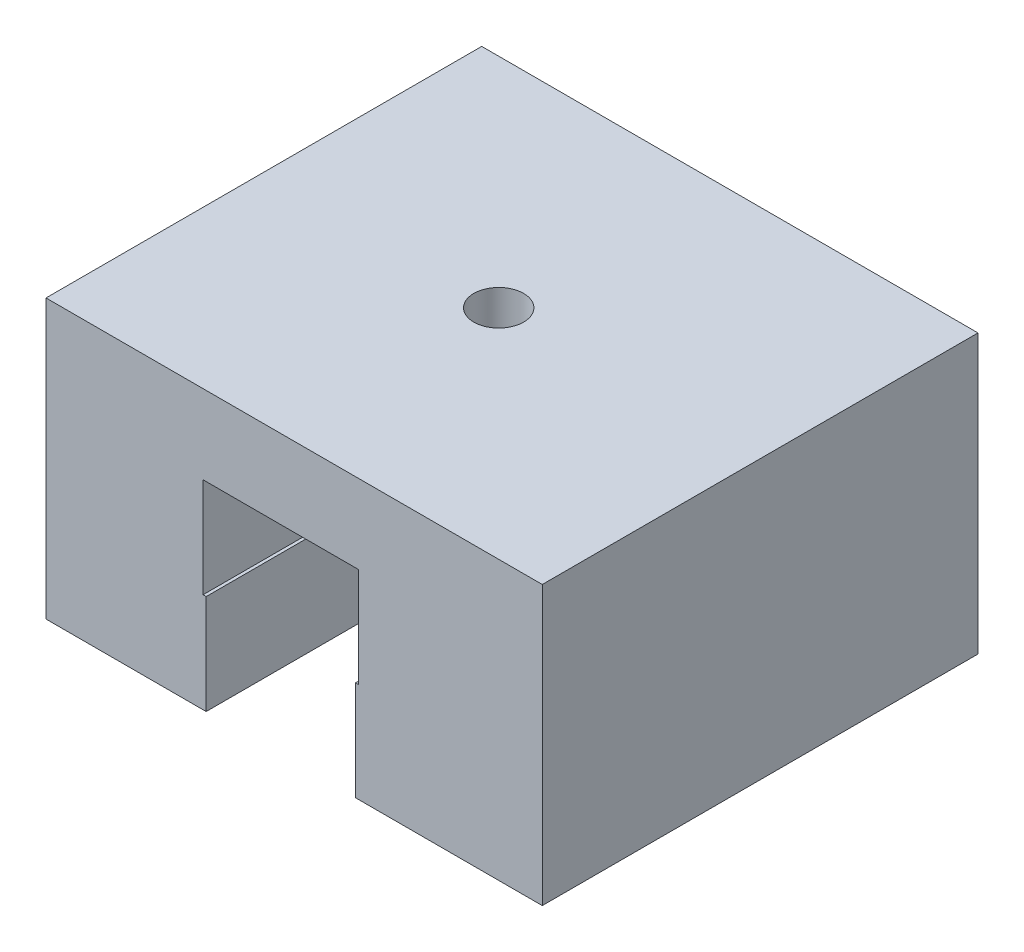
ISO-10303-21;
HEADER;
FILE_DESCRIPTION(('STEP AP214'),'2;1');
FILE_NAME('part.step','',(''),(''),'','','');
FILE_SCHEMA(('AUTOMOTIVE_DESIGN { 1 0 10303 214 1 1 1 1 }'));
ENDSEC;
DATA;
#1=APPLICATION_CONTEXT('core data for automotive mechanical design processes');
#2=APPLICATION_PROTOCOL_DEFINITION('international standard','automotive_design',2000,#1);
#3=PRODUCT_CONTEXT('',#1,'mechanical');
#4=PRODUCT('Part','Part','',(#3));
#5=PRODUCT_RELATED_PRODUCT_CATEGORY('part','',(#4));
#6=PRODUCT_DEFINITION_FORMATION('','',#4);
#7=PRODUCT_DEFINITION_CONTEXT('part definition',#1,'design');
#8=PRODUCT_DEFINITION('design','',#6,#7);
#9=PRODUCT_DEFINITION_SHAPE('','',#8);
#10=(LENGTH_UNIT() NAMED_UNIT(*) SI_UNIT(.MILLI.,.METRE.));
#11=(NAMED_UNIT(*) PLANE_ANGLE_UNIT() SI_UNIT($,.RADIAN.));
#12=(NAMED_UNIT(*) SI_UNIT($,.STERADIAN.) SOLID_ANGLE_UNIT());
#13=UNCERTAINTY_MEASURE_WITH_UNIT(LENGTH_MEASURE(1.E-05),#10,'distance_accuracy_value','');
#14=(GEOMETRIC_REPRESENTATION_CONTEXT(3) GLOBAL_UNCERTAINTY_ASSIGNED_CONTEXT((#13)) GLOBAL_UNIT_ASSIGNED_CONTEXT((#10,
#11,#12)) REPRESENTATION_CONTEXT('',''));
#15=CARTESIAN_POINT('',(0.,0.,0.));
#16=DIRECTION('',(0.,0.,1.));
#17=DIRECTION('',(1.,0.,0.));
#18=AXIS2_PLACEMENT_3D('',#15,#16,#17);
#19=CARTESIAN_POINT('',(-200.,30.,17.4999999999999));
#20=DIRECTION('',(0.,0.,-1.));
#21=DIRECTION('',(-1.,0.,0.));
#22=AXIS2_PLACEMENT_3D('',#19,#20,#21);
#23=PLANE('',#22);
#24=DIRECTION('',(0.,-1.,0.));
#25=VECTOR('',#24,1.);
#26=CARTESIAN_POINT('',(-39.8657799997887,0.,17.5));
#27=LINE('',#26,#25);
#28=CARTESIAN_POINT('',(-39.8657799997887,22.3404540291583,17.5));
#29=VERTEX_POINT('',#28);
#30=CARTESIAN_POINT('',(-39.8657799997887,0.,17.5));
#31=VERTEX_POINT('',#30);
#32=EDGE_CURVE('E130',#29,#31,#27,.T.);
#33=ORIENTED_EDGE('',*,*,#32,.T.);
#34=DIRECTION('',(1.,0.,0.));
#35=VECTOR('',#34,1.);
#36=CARTESIAN_POINT('',(-200.,0.,17.4999999999999));
#37=LINE('',#36,#35);
#38=CARTESIAN_POINT('',(-27.,0.,17.5));
#39=VERTEX_POINT('',#38);
#40=EDGE_CURVE('E222',#31,#39,#37,.T.);
#41=ORIENTED_EDGE('',*,*,#40,.T.);
#42=DIRECTION('',(0.,-1.,0.));
#43=VECTOR('',#42,1.);
#44=CARTESIAN_POINT('',(-27.,8.,17.5));
#45=LINE('',#44,#43);
#46=CARTESIAN_POINT('',(-27.,8.,17.5));
#47=VERTEX_POINT('',#46);
#48=EDGE_CURVE('E167',#47,#39,#45,.T.);
#49=ORIENTED_EDGE('',*,*,#48,.F.);
#50=DIRECTION('',(1.,0.,0.));
#51=VECTOR('',#50,1.);
#52=CARTESIAN_POINT('',(-27.25,8.,17.5));
#53=LINE('',#52,#51);
#54=CARTESIAN_POINT('',(-27.25,8.,17.5));
#55=VERTEX_POINT('',#54);
#56=EDGE_CURVE('E164',#55,#47,#53,.T.);
#57=ORIENTED_EDGE('',*,*,#56,.F.);
#58=DIRECTION('',(0.,-1.,0.));
#59=VECTOR('',#58,1.);
#60=CARTESIAN_POINT('',(-27.25,8.,17.5));
#61=LINE('',#60,#59);
#62=CARTESIAN_POINT('',(-27.25,16.,17.5));
#63=VERTEX_POINT('',#62);
#64=EDGE_CURVE('E161',#63,#55,#61,.T.);
#65=ORIENTED_EDGE('',*,*,#64,.F.);
#66=DIRECTION('',(-1.,0.,0.));
#67=VECTOR('',#66,1.);
#68=CARTESIAN_POINT('',(-21.,16.,17.5));
#69=LINE('',#68,#67);
#70=CARTESIAN_POINT('',(-14.75,16.,17.5));
#71=VERTEX_POINT('',#70);
#72=EDGE_CURVE('E157',#71,#63,#69,.T.);
#73=ORIENTED_EDGE('',*,*,#72,.F.);
#74=DIRECTION('',(0.,1.,0.));
#75=VECTOR('',#74,1.);
#76=CARTESIAN_POINT('',(-14.75,8.,17.5));
#77=LINE('',#76,#75);
#78=CARTESIAN_POINT('',(-14.75,8.,17.5));
#79=VERTEX_POINT('',#78);
#80=EDGE_CURVE('E176',#79,#71,#77,.T.);
#81=ORIENTED_EDGE('',*,*,#80,.F.);
#82=DIRECTION('',(1.,0.,0.));
#83=VECTOR('',#82,1.);
#84=CARTESIAN_POINT('',(-15.,8.,17.5));
#85=LINE('',#84,#83);
#86=CARTESIAN_POINT('',(-15.,8.,17.5));
#87=VERTEX_POINT('',#86);
#88=EDGE_CURVE('E173',#87,#79,#85,.T.);
#89=ORIENTED_EDGE('',*,*,#88,.F.);
#90=DIRECTION('',(0.,1.,0.));
#91=VECTOR('',#90,1.);
#92=CARTESIAN_POINT('',(-15.,0.,17.5));
#93=LINE('',#92,#91);
#94=CARTESIAN_POINT('',(-15.,0.,17.5));
#95=VERTEX_POINT('',#94);
#96=EDGE_CURVE('E170',#95,#87,#93,.T.);
#97=ORIENTED_EDGE('',*,*,#96,.F.);
#98=CARTESIAN_POINT('',(0.,0.,17.5));
#99=VERTEX_POINT('',#98);
#100=EDGE_CURVE('E221',#95,#99,#37,.T.);
#101=ORIENTED_EDGE('',*,*,#100,.T.);
#102=DIRECTION('',(0.,-1.,0.));
#103=VECTOR('',#102,1.);
#104=CARTESIAN_POINT('',(0.,30.,17.5));
#105=LINE('',#104,#103);
#106=CARTESIAN_POINT('',(0.,22.3404540291583,17.5));
#107=VERTEX_POINT('',#106);
#108=EDGE_CURVE('E225',#107,#99,#105,.T.);
#109=ORIENTED_EDGE('',*,*,#108,.F.);
#110=DIRECTION('',(1.,0.,0.));
#111=VECTOR('',#110,1.);
#112=CARTESIAN_POINT('',(0.,22.3404540291583,17.5));
#113=LINE('',#112,#111);
#114=EDGE_CURVE('E146',#29,#107,#113,.T.);
#115=ORIENTED_EDGE('',*,*,#114,.F.);
#116=EDGE_LOOP('',(#33,#41,#49,#57,#65,#73,#81,#89,#97,#101,#109,#115));
#117=FACE_BOUND('',#116,.T.);
#118=ADVANCED_FACE('F33',(#117),#23,.F.);
#119=CARTESIAN_POINT('',(-200.,30.,-17.5));
#120=DIRECTION('',(0.,0.,-1.));
#121=DIRECTION('',(-1.,0.,0.));
#122=AXIS2_PLACEMENT_3D('',#119,#120,#121);
#123=PLANE('',#122);
#124=DIRECTION('',(1.,0.,0.));
#125=VECTOR('',#124,1.);
#126=CARTESIAN_POINT('',(-200.,0.,-17.5));
#127=LINE('',#126,#125);
#128=CARTESIAN_POINT('',(-39.8657799997887,0.,-17.5));
#129=VERTEX_POINT('',#128);
#130=CARTESIAN_POINT('',(0.,0.,-17.5));
#131=VERTEX_POINT('',#130);
#132=EDGE_CURVE('E145',#129,#131,#127,.T.);
#133=ORIENTED_EDGE('',*,*,#132,.F.);
#134=DIRECTION('',(0.,-1.,0.));
#135=VECTOR('',#134,1.);
#136=CARTESIAN_POINT('',(-39.8657799997887,0.,-17.5));
#137=LINE('',#136,#135);
#138=CARTESIAN_POINT('',(-39.8657799997887,22.3404540291583,-17.5));
#139=VERTEX_POINT('',#138);
#140=EDGE_CURVE('E48',#139,#129,#137,.T.);
#141=ORIENTED_EDGE('',*,*,#140,.F.);
#142=DIRECTION('',(1.,0.,0.));
#143=VECTOR('',#142,1.);
#144=CARTESIAN_POINT('',(0.,22.3404540291583,-17.5));
#145=LINE('',#144,#143);
#146=CARTESIAN_POINT('',(0.,22.3404540291583,-17.5));
#147=VERTEX_POINT('',#146);
#148=EDGE_CURVE('E134',#139,#147,#145,.T.);
#149=ORIENTED_EDGE('',*,*,#148,.T.);
#150=DIRECTION('',(0.,-1.,0.));
#151=VECTOR('',#150,1.);
#152=CARTESIAN_POINT('',(0.,30.,-17.5));
#153=LINE('',#152,#151);
#154=EDGE_CURVE('E224',#147,#131,#153,.T.);
#155=ORIENTED_EDGE('',*,*,#154,.T.);
#156=EDGE_LOOP('',(#133,#141,#149,#155));
#157=FACE_BOUND('',#156,.T.);
#158=ADVANCED_FACE('F35',(#157),#123,.T.);
#159=CARTESIAN_POINT('',(0.,0.,0.));
#160=DIRECTION('',(0.,-1.,0.));
#161=DIRECTION('',(0.,0.,-1.));
#162=AXIS2_PLACEMENT_3D('',#159,#160,#161);
#163=PLANE('',#162);
#164=ORIENTED_EDGE('',*,*,#40,.F.);
#165=DIRECTION('',(0.,0.,-1.));
#166=VECTOR('',#165,1.);
#167=CARTESIAN_POINT('',(-39.8657799997887,0.,0.));
#168=LINE('',#167,#166);
#169=EDGE_CURVE('E11',#31,#129,#168,.T.);
#170=ORIENTED_EDGE('',*,*,#169,.T.);
#171=ORIENTED_EDGE('',*,*,#132,.T.);
#172=DIRECTION('',(0.,0.,-1.));
#173=VECTOR('',#172,1.);
#174=CARTESIAN_POINT('',(0.,0.,17.5));
#175=LINE('',#174,#173);
#176=EDGE_CURVE('E218',#99,#131,#175,.T.);
#177=ORIENTED_EDGE('',*,*,#176,.F.);
#178=ORIENTED_EDGE('',*,*,#100,.F.);
#179=DIRECTION('',(0.,0.,1.));
#180=VECTOR('',#179,1.);
#181=CARTESIAN_POINT('',(-15.,0.,0.));
#182=LINE('',#181,#180);
#183=CARTESIAN_POINT('',(-15.,0.,0.));
#184=VERTEX_POINT('',#183);
#185=EDGE_CURVE('E183',#184,#95,#182,.T.);
#186=ORIENTED_EDGE('',*,*,#185,.F.);
#187=CARTESIAN_POINT('',(-21.,0.,0.));
#188=DIRECTION('',(0.,-1.,0.));
#189=DIRECTION('',(0.,0.,-1.));
#190=AXIS2_PLACEMENT_3D('',#187,#188,#189);
#191=CIRCLE('',#190,6.);
#192=CARTESIAN_POINT('',(-27.,0.,0.));
#193=VERTEX_POINT('',#192);
#194=EDGE_CURVE('E214',#193,#184,#191,.T.);
#195=ORIENTED_EDGE('',*,*,#194,.F.);
#196=DIRECTION('',(0.,0.,1.));
#197=VECTOR('',#196,1.);
#198=CARTESIAN_POINT('',(-27.,0.,0.));
#199=LINE('',#198,#197);
#200=EDGE_CURVE('E185',#193,#39,#199,.T.);
#201=ORIENTED_EDGE('',*,*,#200,.T.);
#202=EDGE_LOOP('',(#164,#170,#171,#177,#178,#186,#195,#201));
#203=FACE_BOUND('',#202,.T.);
#204=ADVANCED_FACE('F253',(#203),#163,.T.);
#205=CARTESIAN_POINT('',(-21.,30.,0.));
#206=DIRECTION('',(0.,-1.,0.));
#207=DIRECTION('',(0.,0.,-1.));
#208=AXIS2_PLACEMENT_3D('',#205,#206,#207);
#209=CYLINDRICAL_SURFACE('',#208,6.);
#210=DIRECTION('',(0.,-1.,0.));
#211=VECTOR('',#210,1.);
#212=CARTESIAN_POINT('',(-27.,8.,0.));
#213=LINE('',#212,#211);
#214=CARTESIAN_POINT('',(-27.,8.,0.));
#215=VERTEX_POINT('',#214);
#216=EDGE_CURVE('E153',#215,#193,#213,.T.);
#217=ORIENTED_EDGE('',*,*,#216,.T.);
#218=ORIENTED_EDGE('',*,*,#194,.T.);
#219=DIRECTION('',(0.,1.,0.));
#220=VECTOR('',#219,1.);
#221=CARTESIAN_POINT('',(-15.,0.,0.));
#222=LINE('',#221,#220);
#223=CARTESIAN_POINT('',(-15.,8.,0.));
#224=VERTEX_POINT('',#223);
#225=EDGE_CURVE('E156',#184,#224,#222,.T.);
#226=ORIENTED_EDGE('',*,*,#225,.T.);
#227=CARTESIAN_POINT('',(-21.,8.,0.));
#228=DIRECTION('',(0.,1.,0.));
#229=DIRECTION('',(0.,0.,1.));
#230=AXIS2_PLACEMENT_3D('',#227,#228,#229);
#231=CIRCLE('',#230,6.);
#232=EDGE_CURVE('E208',#215,#224,#231,.F.);
#233=ORIENTED_EDGE('',*,*,#232,.F.);
#234=EDGE_LOOP('',(#217,#218,#226,#233));
#235=FACE_BOUND('',#234,.T.);
#236=ADVANCED_FACE('F259',(#235),#209,.F.);
#237=CARTESIAN_POINT('',(0.,30.,17.5));
#238=DIRECTION('',(-1.,0.,0.));
#239=DIRECTION('',(0.,0.,1.));
#240=AXIS2_PLACEMENT_3D('',#237,#238,#239);
#241=PLANE('',#240);
#242=ORIENTED_EDGE('',*,*,#154,.F.);
#243=DIRECTION('',(0.,0.,1.));
#244=VECTOR('',#243,1.);
#245=CARTESIAN_POINT('',(0.,22.3404540291583,17.5));
#246=LINE('',#245,#244);
#247=EDGE_CURVE('E139',#147,#107,#246,.T.);
#248=ORIENTED_EDGE('',*,*,#247,.T.);
#249=ORIENTED_EDGE('',*,*,#108,.T.);
#250=ORIENTED_EDGE('',*,*,#176,.T.);
#251=EDGE_LOOP('',(#242,#248,#249,#250));
#252=FACE_BOUND('',#251,.T.);
#253=ADVANCED_FACE('F256',(#252),#241,.F.);
#254=CARTESIAN_POINT('',(0.,8.,0.));
#255=DIRECTION('',(0.,1.,0.));
#256=DIRECTION('',(0.,0.,1.));
#257=AXIS2_PLACEMENT_3D('',#254,#255,#256);
#258=PLANE('',#257);
#259=DIRECTION('',(0.,0.,1.));
#260=VECTOR('',#259,1.);
#261=CARTESIAN_POINT('',(-15.,8.,0.));
#262=LINE('',#261,#260);
#263=EDGE_CURVE('E181',#224,#87,#262,.T.);
#264=ORIENTED_EDGE('',*,*,#263,.T.);
#265=ORIENTED_EDGE('',*,*,#88,.T.);
#266=DIRECTION('',(0.,0.,-1.));
#267=VECTOR('',#266,1.);
#268=CARTESIAN_POINT('',(-14.75,8.,3.60843918243516));
#269=LINE('',#268,#267);
#270=CARTESIAN_POINT('',(-14.75,8.,-3.60843918243516));
#271=VERTEX_POINT('',#270);
#272=EDGE_CURVE('E194',#79,#271,#269,.T.);
#273=ORIENTED_EDGE('',*,*,#272,.T.);
#274=DIRECTION('',(-0.866025403784439,0.,-0.5));
#275=VECTOR('',#274,1.);
#276=CARTESIAN_POINT('',(-14.75,8.,-3.60843918243516));
#277=LINE('',#276,#275);
#278=CARTESIAN_POINT('',(-21.,8.,-7.21687836487032));
#279=VERTEX_POINT('',#278);
#280=EDGE_CURVE('E196',#271,#279,#277,.T.);
#281=ORIENTED_EDGE('',*,*,#280,.T.);
#282=DIRECTION('',(-0.866025403784439,0.,0.5));
#283=VECTOR('',#282,1.);
#284=CARTESIAN_POINT('',(-21.,8.,-7.21687836487032));
#285=LINE('',#284,#283);
#286=CARTESIAN_POINT('',(-27.25,8.,-3.60843918243516));
#287=VERTEX_POINT('',#286);
#288=EDGE_CURVE('E199',#279,#287,#285,.T.);
#289=ORIENTED_EDGE('',*,*,#288,.T.);
#290=DIRECTION('',(0.,0.,1.));
#291=VECTOR('',#290,1.);
#292=CARTESIAN_POINT('',(-27.25,8.,-3.60843918243516));
#293=LINE('',#292,#291);
#294=EDGE_CURVE('E202',#287,#55,#293,.T.);
#295=ORIENTED_EDGE('',*,*,#294,.T.);
#296=ORIENTED_EDGE('',*,*,#56,.T.);
#297=DIRECTION('',(0.,0.,1.));
#298=VECTOR('',#297,1.);
#299=CARTESIAN_POINT('',(-27.,8.,0.));
#300=LINE('',#299,#298);
#301=EDGE_CURVE('E160',#215,#47,#300,.T.);
#302=ORIENTED_EDGE('',*,*,#301,.F.);
#303=ORIENTED_EDGE('',*,*,#232,.T.);
#304=EDGE_LOOP('',(#264,#265,#273,#281,#289,#295,#296,#302,#303));
#305=FACE_BOUND('',#304,.T.);
#306=ADVANCED_FACE('F258',(#305),#258,.T.);
#307=CARTESIAN_POINT('',(-14.75,8.,3.60843918243516));
#308=DIRECTION('',(1.,0.,0.));
#309=DIRECTION('',(0.,0.,-1.));
#310=AXIS2_PLACEMENT_3D('',#307,#308,#309);
#311=PLANE('',#310);
#312=DIRECTION('',(0.,0.,-1.));
#313=VECTOR('',#312,1.);
#314=CARTESIAN_POINT('',(-14.75,16.,3.60843918243516));
#315=LINE('',#314,#313);
#316=CARTESIAN_POINT('',(-14.75,16.,-3.60843918243516));
#317=VERTEX_POINT('',#316);
#318=EDGE_CURVE('E192',#71,#317,#315,.T.);
#319=ORIENTED_EDGE('',*,*,#318,.T.);
#320=DIRECTION('',(0.,1.,0.));
#321=VECTOR('',#320,1.);
#322=CARTESIAN_POINT('',(-14.75,8.,-3.60843918243516));
#323=LINE('',#322,#321);
#324=EDGE_CURVE('E204',#271,#317,#323,.T.);
#325=ORIENTED_EDGE('',*,*,#324,.F.);
#326=ORIENTED_EDGE('',*,*,#272,.F.);
#327=ORIENTED_EDGE('',*,*,#80,.T.);
#328=EDGE_LOOP('',(#319,#325,#326,#327));
#329=FACE_BOUND('',#328,.T.);
#330=ADVANCED_FACE('F265',(#329),#311,.F.);
#331=CARTESIAN_POINT('',(-27.25,8.,-3.60843918243516));
#332=DIRECTION('',(-1.,0.,0.));
#333=DIRECTION('',(0.,0.,1.));
#334=AXIS2_PLACEMENT_3D('',#331,#332,#333);
#335=PLANE('',#334);
#336=ORIENTED_EDGE('',*,*,#64,.T.);
#337=ORIENTED_EDGE('',*,*,#294,.F.);
#338=DIRECTION('',(0.,1.,0.));
#339=VECTOR('',#338,1.);
#340=CARTESIAN_POINT('',(-27.25,8.,-3.60843918243516));
#341=LINE('',#340,#339);
#342=CARTESIAN_POINT('',(-27.25,16.,-3.60843918243516));
#343=VERTEX_POINT('',#342);
#344=EDGE_CURVE('E205',#287,#343,#341,.T.);
#345=ORIENTED_EDGE('',*,*,#344,.T.);
#346=DIRECTION('',(0.,0.,1.));
#347=VECTOR('',#346,1.);
#348=CARTESIAN_POINT('',(-27.25,16.,-3.60843918243516));
#349=LINE('',#348,#347);
#350=EDGE_CURVE('E190',#343,#63,#349,.T.);
#351=ORIENTED_EDGE('',*,*,#350,.T.);
#352=EDGE_LOOP('',(#336,#337,#345,#351));
#353=FACE_BOUND('',#352,.T.);
#354=ADVANCED_FACE('F290',(#353),#335,.F.);
#355=CARTESIAN_POINT('',(-21.,8.,-7.21687836487032));
#356=DIRECTION('',(-0.5,0.,-0.866025403784439));
#357=DIRECTION('',(-0.866025403784439,0.,0.5));
#358=AXIS2_PLACEMENT_3D('',#355,#356,#357);
#359=PLANE('',#358);
#360=DIRECTION('',(0.,1.,0.));
#361=VECTOR('',#360,1.);
#362=CARTESIAN_POINT('',(-21.,8.,-7.21687836487032));
#363=LINE('',#362,#361);
#364=CARTESIAN_POINT('',(-21.,16.,-7.21687836487032));
#365=VERTEX_POINT('',#364);
#366=EDGE_CURVE('E209',#279,#365,#363,.T.);
#367=ORIENTED_EDGE('',*,*,#366,.T.);
#368=DIRECTION('',(-0.866025403784439,0.,0.5));
#369=VECTOR('',#368,1.);
#370=CARTESIAN_POINT('',(-21.,16.,-7.21687836487032));
#371=LINE('',#370,#369);
#372=EDGE_CURVE('E55',#365,#343,#371,.T.);
#373=ORIENTED_EDGE('',*,*,#372,.T.);
#374=ORIENTED_EDGE('',*,*,#344,.F.);
#375=ORIENTED_EDGE('',*,*,#288,.F.);
#376=EDGE_LOOP('',(#367,#373,#374,#375));
#377=FACE_BOUND('',#376,.T.);
#378=ADVANCED_FACE('F310',(#377),#359,.F.);
#379=CARTESIAN_POINT('',(-14.75,8.,-3.60843918243516));
#380=DIRECTION('',(0.5,0.,-0.866025403784439));
#381=DIRECTION('',(-0.866025403784439,0.,-0.5));
#382=AXIS2_PLACEMENT_3D('',#379,#380,#381);
#383=PLANE('',#382);
#384=ORIENTED_EDGE('',*,*,#324,.T.);
#385=DIRECTION('',(-0.866025403784439,0.,-0.5));
#386=VECTOR('',#385,1.);
#387=CARTESIAN_POINT('',(-14.75,16.,-3.60843918243516));
#388=LINE('',#387,#386);
#389=EDGE_CURVE('E41',#317,#365,#388,.T.);
#390=ORIENTED_EDGE('',*,*,#389,.T.);
#391=ORIENTED_EDGE('',*,*,#366,.F.);
#392=ORIENTED_EDGE('',*,*,#280,.F.);
#393=EDGE_LOOP('',(#384,#390,#391,#392));
#394=FACE_BOUND('',#393,.T.);
#395=ADVANCED_FACE('F304',(#394),#383,.F.);
#396=CARTESIAN_POINT('',(-38.,16.,11.0434775432545));
#397=DIRECTION('',(0.,-1.,0.));
#398=DIRECTION('',(0.,0.,-1.));
#399=AXIS2_PLACEMENT_3D('',#396,#397,#398);
#400=PLANE('',#399);
#401=CARTESIAN_POINT('',(-21.,16.,0.));
#402=DIRECTION('',(0.,-1.,0.));
#403=DIRECTION('',(0.,0.,-1.));
#404=AXIS2_PLACEMENT_3D('',#401,#402,#403);
#405=CIRCLE('',#404,2.);
#406=CARTESIAN_POINT('',(-21.,16.,-2.));
#407=VERTEX_POINT('',#406);
#408=EDGE_CURVE('E152',#407,#407,#405,.T.);
#409=ORIENTED_EDGE('',*,*,#408,.F.);
#410=EDGE_LOOP('',(#409));
#411=FACE_BOUND('',#410,.T.);
#412=ORIENTED_EDGE('',*,*,#318,.F.);
#413=ORIENTED_EDGE('',*,*,#72,.T.);
#414=ORIENTED_EDGE('',*,*,#350,.F.);
#415=ORIENTED_EDGE('',*,*,#372,.F.);
#416=ORIENTED_EDGE('',*,*,#389,.F.);
#417=EDGE_LOOP('',(#412,#413,#414,#415,#416));
#418=FACE_BOUND('',#417,.T.);
#419=ADVANCED_FACE('F291',(#411,#418),#400,.T.);
#420=CARTESIAN_POINT('',(-15.,0.,0.));
#421=DIRECTION('',(1.,0.,0.));
#422=DIRECTION('',(0.,0.,-1.));
#423=AXIS2_PLACEMENT_3D('',#420,#421,#422);
#424=PLANE('',#423);
#425=ORIENTED_EDGE('',*,*,#96,.T.);
#426=ORIENTED_EDGE('',*,*,#263,.F.);
#427=ORIENTED_EDGE('',*,*,#225,.F.);
#428=ORIENTED_EDGE('',*,*,#185,.T.);
#429=EDGE_LOOP('',(#425,#426,#427,#428));
#430=FACE_BOUND('',#429,.T.);
#431=ADVANCED_FACE('F296',(#430),#424,.F.);
#432=CARTESIAN_POINT('',(-27.,8.,0.));
#433=DIRECTION('',(-1.,0.,0.));
#434=DIRECTION('',(0.,0.,1.));
#435=AXIS2_PLACEMENT_3D('',#432,#433,#434);
#436=PLANE('',#435);
#437=ORIENTED_EDGE('',*,*,#48,.T.);
#438=ORIENTED_EDGE('',*,*,#200,.F.);
#439=ORIENTED_EDGE('',*,*,#216,.F.);
#440=ORIENTED_EDGE('',*,*,#301,.T.);
#441=EDGE_LOOP('',(#437,#438,#439,#440));
#442=FACE_BOUND('',#441,.T.);
#443=ADVANCED_FACE('F245',(#442),#436,.F.);
#444=CARTESIAN_POINT('',(-21.,-8.,0.));
#445=DIRECTION('',(0.,1.,0.));
#446=DIRECTION('',(0.,0.,1.));
#447=AXIS2_PLACEMENT_3D('',#444,#445,#446);
#448=CYLINDRICAL_SURFACE('',#447,2.);
#449=CARTESIAN_POINT('',(-21.,22.3404540291583,0.));
#450=DIRECTION('',(0.,-1.,0.));
#451=DIRECTION('',(0.,0.,-1.));
#452=AXIS2_PLACEMENT_3D('',#449,#450,#451);
#453=CIRCLE('',#452,2.);
#454=CARTESIAN_POINT('',(-21.,22.3404540291583,-2.));
#455=VERTEX_POINT('',#454);
#456=EDGE_CURVE('E133',#455,#455,#453,.F.);
#457=ORIENTED_EDGE('',*,*,#456,.T.);
#458=EDGE_LOOP('',(#457));
#459=FACE_BOUND('',#458,.T.);
#460=ORIENTED_EDGE('',*,*,#408,.T.);
#461=EDGE_LOOP('',(#460));
#462=FACE_BOUND('',#461,.T.);
#463=ADVANCED_FACE('F235',(#459,#462),#448,.F.);
#464=CARTESIAN_POINT('',(0.,22.3404540291583,-17.5));
#465=DIRECTION('',(0.,-1.,0.));
#466=DIRECTION('',(0.,0.,-1.));
#467=AXIS2_PLACEMENT_3D('',#464,#465,#466);
#468=PLANE('',#467);
#469=ORIENTED_EDGE('',*,*,#456,.F.);
#470=EDGE_LOOP('',(#469));
#471=FACE_BOUND('',#470,.T.);
#472=ORIENTED_EDGE('',*,*,#148,.F.);
#473=DIRECTION('',(0.,0.,1.));
#474=VECTOR('',#473,1.);
#475=CARTESIAN_POINT('',(-39.8657799997887,22.3404540291583,-17.5));
#476=LINE('',#475,#474);
#477=EDGE_CURVE('E126',#139,#29,#476,.T.);
#478=ORIENTED_EDGE('',*,*,#477,.T.);
#479=ORIENTED_EDGE('',*,*,#114,.T.);
#480=ORIENTED_EDGE('',*,*,#247,.F.);
#481=EDGE_LOOP('',(#472,#478,#479,#480));
#482=FACE_BOUND('',#481,.T.);
#483=ADVANCED_FACE('F137',(#471,#482),#468,.F.);
#484=CARTESIAN_POINT('',(-39.8657799997887,0.,-17.5));
#485=DIRECTION('',(-1.,0.,0.));
#486=DIRECTION('',(0.,0.,1.));
#487=AXIS2_PLACEMENT_3D('',#484,#485,#486);
#488=PLANE('',#487);
#489=ORIENTED_EDGE('',*,*,#32,.F.);
#490=ORIENTED_EDGE('',*,*,#477,.F.);
#491=ORIENTED_EDGE('',*,*,#140,.T.);
#492=ORIENTED_EDGE('',*,*,#169,.F.);
#493=EDGE_LOOP('',(#489,#490,#491,#492));
#494=FACE_BOUND('',#493,.T.);
#495=ADVANCED_FACE('F128',(#494),#488,.T.);
#496=CLOSED_SHELL('',(#118,#158,#204,#236,#253,#306,#330,#354,#378,#395,#419,#431,#443,#463,
#483,#495));
#497=MANIFOLD_SOLID_BREP('B2',#496);
#498=ADVANCED_BREP_SHAPE_REPRESENTATION('',(#18,#497),#14);
#499=SHAPE_DEFINITION_REPRESENTATION(#9,#498);
ENDSEC;
END-ISO-10303-21;
